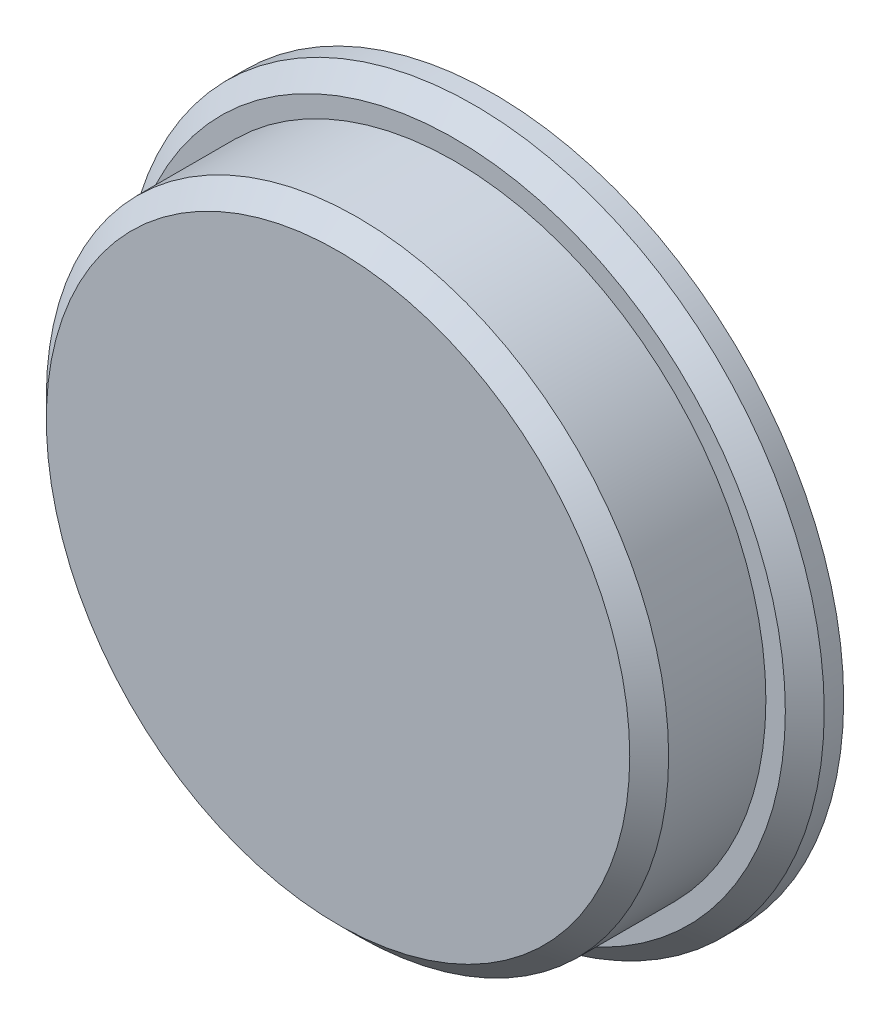
ISO-10303-21;
HEADER;
FILE_DESCRIPTION(('STEP AP214'),'2;1');
FILE_NAME('part.step','',(''),(''),'','','');
FILE_SCHEMA(('AUTOMOTIVE_DESIGN { 1 0 10303 214 1 1 1 1 }'));
ENDSEC;
DATA;
#1=APPLICATION_CONTEXT('core data for automotive mechanical design processes');
#2=APPLICATION_PROTOCOL_DEFINITION('international standard','automotive_design',2000,#1);
#3=PRODUCT_CONTEXT('',#1,'mechanical');
#4=PRODUCT('Part','Part','',(#3));
#5=PRODUCT_RELATED_PRODUCT_CATEGORY('part','',(#4));
#6=PRODUCT_DEFINITION_FORMATION('','',#4);
#7=PRODUCT_DEFINITION_CONTEXT('part definition',#1,'design');
#8=PRODUCT_DEFINITION('design','',#6,#7);
#9=PRODUCT_DEFINITION_SHAPE('','',#8);
#10=(LENGTH_UNIT() NAMED_UNIT(*) SI_UNIT(.MILLI.,.METRE.));
#11=(NAMED_UNIT(*) PLANE_ANGLE_UNIT() SI_UNIT($,.RADIAN.));
#12=(NAMED_UNIT(*) SI_UNIT($,.STERADIAN.) SOLID_ANGLE_UNIT());
#13=UNCERTAINTY_MEASURE_WITH_UNIT(LENGTH_MEASURE(1.E-05),#10,'distance_accuracy_value','');
#14=(GEOMETRIC_REPRESENTATION_CONTEXT(3) GLOBAL_UNCERTAINTY_ASSIGNED_CONTEXT((#13)) GLOBAL_UNIT_ASSIGNED_CONTEXT((#10,
#11,#12)) REPRESENTATION_CONTEXT('',''));
#15=CARTESIAN_POINT('',(0.,0.,0.));
#16=DIRECTION('',(0.,0.,1.));
#17=DIRECTION('',(1.,0.,0.));
#18=AXIS2_PLACEMENT_3D('',#15,#16,#17);
#19=CARTESIAN_POINT('',(0.,0.,1.));
#20=DIRECTION('',(0.,0.,-1.));
#21=DIRECTION('',(-1.,0.,0.));
#22=AXIS2_PLACEMENT_3D('',#19,#20,#21);
#23=CYLINDRICAL_SURFACE('',#22,9.);
#24=CARTESIAN_POINT('',(0.,0.,0.5));
#25=DIRECTION('',(0.,0.,1.));
#26=DIRECTION('',(1.,0.,0.));
#27=AXIS2_PLACEMENT_3D('',#24,#25,#26);
#28=CIRCLE('',#27,9.);
#29=CARTESIAN_POINT('',(9.,0.,0.5));
#30=VERTEX_POINT('',#29);
#31=EDGE_CURVE('E48',#30,#30,#28,.F.);
#32=ORIENTED_EDGE('',*,*,#31,.T.);
#33=EDGE_LOOP('',(#32));
#34=FACE_BOUND('',#33,.T.);
#35=CARTESIAN_POINT('',(0.,0.,0.));
#36=DIRECTION('',(0.,0.,1.));
#37=DIRECTION('',(1.,0.,0.));
#38=AXIS2_PLACEMENT_3D('',#35,#36,#37);
#39=CIRCLE('',#38,9.);
#40=CARTESIAN_POINT('',(9.,0.,0.));
#41=VERTEX_POINT('',#40);
#42=EDGE_CURVE('E56',#41,#41,#39,.T.);
#43=ORIENTED_EDGE('',*,*,#42,.T.);
#44=EDGE_LOOP('',(#43));
#45=FACE_BOUND('',#44,.T.);
#46=ADVANCED_FACE('F32',(#34,#45),#23,.T.);
#47=CARTESIAN_POINT('',(0.,0.,1.));
#48=DIRECTION('',(0.,0.,1.));
#49=DIRECTION('',(1.,0.,0.));
#50=AXIS2_PLACEMENT_3D('',#47,#48,#49);
#51=PLANE('',#50);
#52=CARTESIAN_POINT('',(0.,0.,1.));
#53=DIRECTION('',(0.,0.,1.));
#54=DIRECTION('',(1.,0.,0.));
#55=AXIS2_PLACEMENT_3D('',#52,#53,#54);
#56=CIRCLE('',#55,8.);
#57=CARTESIAN_POINT('',(8.,0.,1.));
#58=VERTEX_POINT('',#57);
#59=EDGE_CURVE('E44',#58,#58,#56,.T.);
#60=ORIENTED_EDGE('',*,*,#59,.F.);
#61=EDGE_LOOP('',(#60));
#62=FACE_BOUND('',#61,.T.);
#63=CARTESIAN_POINT('',(0.,0.,1.));
#64=DIRECTION('',(0.,0.,1.));
#65=DIRECTION('',(1.,0.,0.));
#66=AXIS2_PLACEMENT_3D('',#63,#64,#65);
#67=CIRCLE('',#66,8.5);
#68=CARTESIAN_POINT('',(8.5,0.,1.));
#69=VERTEX_POINT('',#68);
#70=EDGE_CURVE('E53',#69,#69,#67,.T.);
#71=ORIENTED_EDGE('',*,*,#70,.T.);
#72=EDGE_LOOP('',(#71));
#73=FACE_BOUND('',#72,.T.);
#74=ADVANCED_FACE('F64',(#62,#73),#51,.T.);
#75=CARTESIAN_POINT('',(0.,0.,0.));
#76=DIRECTION('',(0.,0.,1.));
#77=DIRECTION('',(1.,0.,0.));
#78=AXIS2_PLACEMENT_3D('',#75,#76,#77);
#79=PLANE('',#78);
#80=ORIENTED_EDGE('',*,*,#42,.F.);
#81=EDGE_LOOP('',(#80));
#82=FACE_BOUND('',#81,.T.);
#83=ADVANCED_FACE('F61',(#82),#79,.F.);
#84=CARTESIAN_POINT('',(0.,0.,1.));
#85=DIRECTION('',(0.,0.,-1.));
#86=DIRECTION('',(-1.,0.,0.));
#87=AXIS2_PLACEMENT_3D('',#84,#85,#86);
#88=CONICAL_SURFACE('',#87,8.5,0.785398163397445);
#89=ORIENTED_EDGE('',*,*,#31,.F.);
#90=EDGE_LOOP('',(#89));
#91=FACE_BOUND('',#90,.T.);
#92=ORIENTED_EDGE('',*,*,#70,.F.);
#93=EDGE_LOOP('',(#92));
#94=FACE_BOUND('',#93,.T.);
#95=ADVANCED_FACE('F63',(#91,#94),#88,.T.);
#96=CARTESIAN_POINT('',(0.,0.,4.));
#97=DIRECTION('',(0.,0.,-1.));
#98=DIRECTION('',(-1.,0.,0.));
#99=AXIS2_PLACEMENT_3D('',#96,#97,#98);
#100=CYLINDRICAL_SURFACE('',#99,8.);
#101=CARTESIAN_POINT('',(0.,0.,3.5));
#102=DIRECTION('',(0.,0.,1.));
#103=DIRECTION('',(1.,0.,0.));
#104=AXIS2_PLACEMENT_3D('',#101,#102,#103);
#105=CIRCLE('',#104,8.);
#106=CARTESIAN_POINT('',(8.,0.,3.5));
#107=VERTEX_POINT('',#106);
#108=EDGE_CURVE('E10',#107,#107,#105,.F.);
#109=ORIENTED_EDGE('',*,*,#108,.T.);
#110=EDGE_LOOP('',(#109));
#111=FACE_BOUND('',#110,.T.);
#112=ORIENTED_EDGE('',*,*,#59,.T.);
#113=EDGE_LOOP('',(#112));
#114=FACE_BOUND('',#113,.T.);
#115=ADVANCED_FACE('F70',(#111,#114),#100,.T.);
#116=CARTESIAN_POINT('',(0.,0.,4.));
#117=DIRECTION('',(0.,0.,1.));
#118=DIRECTION('',(1.,0.,0.));
#119=AXIS2_PLACEMENT_3D('',#116,#117,#118);
#120=PLANE('',#119);
#121=CARTESIAN_POINT('',(0.,0.,4.));
#122=DIRECTION('',(0.,0.,1.));
#123=DIRECTION('',(1.,0.,0.));
#124=AXIS2_PLACEMENT_3D('',#121,#122,#123);
#125=CIRCLE('',#124,7.5);
#126=CARTESIAN_POINT('',(7.5,0.,4.));
#127=VERTEX_POINT('',#126);
#128=EDGE_CURVE('E40',#127,#127,#125,.T.);
#129=ORIENTED_EDGE('',*,*,#128,.T.);
#130=EDGE_LOOP('',(#129));
#131=FACE_BOUND('',#130,.T.);
#132=ADVANCED_FACE('F105',(#131),#120,.T.);
#133=CARTESIAN_POINT('',(0.,0.,4.));
#134=DIRECTION('',(0.,0.,-1.));
#135=DIRECTION('',(-1.,0.,0.));
#136=AXIS2_PLACEMENT_3D('',#133,#134,#135);
#137=CONICAL_SURFACE('',#136,7.5,0.785398163397445);
#138=ORIENTED_EDGE('',*,*,#108,.F.);
#139=EDGE_LOOP('',(#138));
#140=FACE_BOUND('',#139,.T.);
#141=ORIENTED_EDGE('',*,*,#128,.F.);
#142=EDGE_LOOP('',(#141));
#143=FACE_BOUND('',#142,.T.);
#144=ADVANCED_FACE('F35',(#140,#143),#137,.T.);
#145=CLOSED_SHELL('',(#46,#74,#83,#95,#115,#132,#144));
#146=MANIFOLD_SOLID_BREP('B2',#145);
#147=ADVANCED_BREP_SHAPE_REPRESENTATION('',(#18,#146),#14);
#148=SHAPE_DEFINITION_REPRESENTATION(#9,#147);
ENDSEC;
END-ISO-10303-21;
